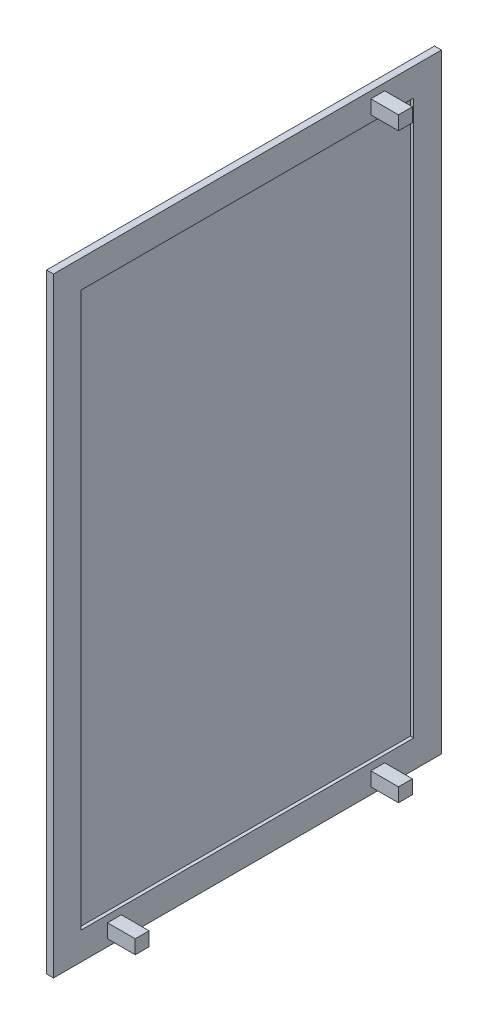
ISO-10303-21;
HEADER;
FILE_DESCRIPTION(('STEP AP214'),'2;1');
FILE_NAME('part.step','',(''),(''),'','','');
FILE_SCHEMA(('AUTOMOTIVE_DESIGN { 1 0 10303 214 1 1 1 1 }'));
ENDSEC;
DATA;
#1=APPLICATION_CONTEXT('core data for automotive mechanical design processes');
#2=APPLICATION_PROTOCOL_DEFINITION('international standard','automotive_design',2000,#1);
#3=PRODUCT_CONTEXT('',#1,'mechanical');
#4=PRODUCT('Part','Part','',(#3));
#5=PRODUCT_RELATED_PRODUCT_CATEGORY('part','',(#4));
#6=PRODUCT_DEFINITION_FORMATION('','',#4);
#7=PRODUCT_DEFINITION_CONTEXT('part definition',#1,'design');
#8=PRODUCT_DEFINITION('design','',#6,#7);
#9=PRODUCT_DEFINITION_SHAPE('','',#8);
#10=(LENGTH_UNIT() NAMED_UNIT(*) SI_UNIT(.MILLI.,.METRE.));
#11=(NAMED_UNIT(*) PLANE_ANGLE_UNIT() SI_UNIT($,.RADIAN.));
#12=(NAMED_UNIT(*) SI_UNIT($,.STERADIAN.) SOLID_ANGLE_UNIT());
#13=UNCERTAINTY_MEASURE_WITH_UNIT(LENGTH_MEASURE(1.E-05),#10,'distance_accuracy_value','');
#14=(GEOMETRIC_REPRESENTATION_CONTEXT(3) GLOBAL_UNCERTAINTY_ASSIGNED_CONTEXT((#13)) GLOBAL_UNIT_ASSIGNED_CONTEXT((#10,
#11,#12)) REPRESENTATION_CONTEXT('',''));
#15=CARTESIAN_POINT('',(0.,0.,0.));
#16=DIRECTION('',(0.,0.,1.));
#17=DIRECTION('',(1.,0.,0.));
#18=AXIS2_PLACEMENT_3D('',#15,#16,#17);
#19=CARTESIAN_POINT('',(1.25,0.,0.));
#20=DIRECTION('',(-1.,0.,0.));
#21=DIRECTION('',(0.,0.,1.));
#22=AXIS2_PLACEMENT_3D('',#19,#20,#21);
#23=PLANE('',#22);
#24=DIRECTION('',(0.,0.,-1.));
#25=VECTOR('',#24,1.);
#26=CARTESIAN_POINT('',(1.25,5.,-5.00000000000001));
#27=LINE('',#26,#25);
#28=CARTESIAN_POINT('',(1.25,5.,-5.00000000000001));
#29=VERTEX_POINT('',#28);
#30=CARTESIAN_POINT('',(1.25,5.,-65.));
#31=VERTEX_POINT('',#30);
#32=EDGE_CURVE('E199',#29,#31,#27,.T.);
#33=ORIENTED_EDGE('',*,*,#32,.F.);
#34=DIRECTION('',(0.,-1.,0.));
#35=VECTOR('',#34,1.);
#36=CARTESIAN_POINT('',(1.25,105.,-5.));
#37=LINE('',#36,#35);
#38=CARTESIAN_POINT('',(1.25,105.,-5.));
#39=VERTEX_POINT('',#38);
#40=EDGE_CURVE('E48',#39,#29,#37,.T.);
#41=ORIENTED_EDGE('',*,*,#40,.F.);
#42=DIRECTION('',(0.,0.,1.));
#43=VECTOR('',#42,1.);
#44=CARTESIAN_POINT('',(1.25,105.,-5.));
#45=LINE('',#44,#43);
#46=CARTESIAN_POINT('',(1.25,105.,-65.));
#47=VERTEX_POINT('',#46);
#48=EDGE_CURVE('E190',#47,#39,#45,.T.);
#49=ORIENTED_EDGE('',*,*,#48,.F.);
#50=DIRECTION('',(0.,1.,0.));
#51=VECTOR('',#50,1.);
#52=CARTESIAN_POINT('',(1.25,105.,-65.));
#53=LINE('',#52,#51);
#54=EDGE_CURVE('E193',#31,#47,#53,.T.);
#55=ORIENTED_EDGE('',*,*,#54,.F.);
#56=EDGE_LOOP('',(#33,#41,#49,#55));
#57=FACE_BOUND('',#56,.T.);
#58=DIRECTION('',(0.,-1.,0.));
#59=VECTOR('',#58,1.);
#60=CARTESIAN_POINT('',(1.25,3.75,-9.75000000000001));
#61=LINE('',#60,#59);
#62=CARTESIAN_POINT('',(1.25,3.75,-9.75000000000001));
#63=VERTEX_POINT('',#62);
#64=CARTESIAN_POINT('',(1.25,1.25,-9.75000000000001));
#65=VERTEX_POINT('',#64);
#66=EDGE_CURVE('E238',#63,#65,#61,.T.);
#67=ORIENTED_EDGE('',*,*,#66,.F.);
#68=DIRECTION('',(0.,0.,1.));
#69=VECTOR('',#68,1.);
#70=CARTESIAN_POINT('',(1.25,3.75,-9.75000000000001));
#71=LINE('',#70,#69);
#72=CARTESIAN_POINT('',(1.25,3.75,-12.25));
#73=VERTEX_POINT('',#72);
#74=EDGE_CURVE('E243',#73,#63,#71,.T.);
#75=ORIENTED_EDGE('',*,*,#74,.F.);
#76=DIRECTION('',(0.,1.,0.));
#77=VECTOR('',#76,1.);
#78=CARTESIAN_POINT('',(1.25,3.75,-12.25));
#79=LINE('',#78,#77);
#80=CARTESIAN_POINT('',(1.25,1.25,-12.25));
#81=VERTEX_POINT('',#80);
#82=EDGE_CURVE('E255',#81,#73,#79,.T.);
#83=ORIENTED_EDGE('',*,*,#82,.F.);
#84=DIRECTION('',(0.,0.,-1.));
#85=VECTOR('',#84,1.);
#86=CARTESIAN_POINT('',(1.25,1.25,-9.75000000000001));
#87=LINE('',#86,#85);
#88=EDGE_CURVE('E252',#65,#81,#87,.T.);
#89=ORIENTED_EDGE('',*,*,#88,.F.);
#90=EDGE_LOOP('',(#67,#75,#83,#89));
#91=FACE_BOUND('',#90,.T.);
#92=DIRECTION('',(0.,-1.,0.));
#93=VECTOR('',#92,1.);
#94=CARTESIAN_POINT('',(1.25,0.,0.));
#95=LINE('',#94,#93);
#96=CARTESIAN_POINT('',(1.25,110.,0.));
#97=VERTEX_POINT('',#96);
#98=CARTESIAN_POINT('',(1.25,0.,0.));
#99=VERTEX_POINT('',#98);
#100=EDGE_CURVE('E305',#97,#99,#95,.T.);
#101=ORIENTED_EDGE('',*,*,#100,.T.);
#102=DIRECTION('',(0.,0.,-1.));
#103=VECTOR('',#102,1.);
#104=CARTESIAN_POINT('',(1.25,0.,0.));
#105=LINE('',#104,#103);
#106=CARTESIAN_POINT('',(1.25,0.,-70.));
#107=VERTEX_POINT('',#106);
#108=EDGE_CURVE('E308',#99,#107,#105,.T.);
#109=ORIENTED_EDGE('',*,*,#108,.T.);
#110=DIRECTION('',(0.,1.,0.));
#111=VECTOR('',#110,1.);
#112=CARTESIAN_POINT('',(1.25,0.,-70.));
#113=LINE('',#112,#111);
#114=CARTESIAN_POINT('',(1.25,110.,-70.));
#115=VERTEX_POINT('',#114);
#116=EDGE_CURVE('E311',#107,#115,#113,.T.);
#117=ORIENTED_EDGE('',*,*,#116,.T.);
#118=DIRECTION('',(0.,0.,1.));
#119=VECTOR('',#118,1.);
#120=CARTESIAN_POINT('',(1.25,110.,0.));
#121=LINE('',#120,#119);
#122=EDGE_CURVE('E313',#115,#97,#121,.T.);
#123=ORIENTED_EDGE('',*,*,#122,.T.);
#124=EDGE_LOOP('',(#101,#109,#117,#123));
#125=FACE_BOUND('',#124,.T.);
#126=DIRECTION('',(0.,-1.,0.));
#127=VECTOR('',#126,1.);
#128=CARTESIAN_POINT('',(1.25,108.75,-57.25));
#129=LINE('',#128,#127);
#130=CARTESIAN_POINT('',(1.25,108.75,-57.25));
#131=VERTEX_POINT('',#130);
#132=CARTESIAN_POINT('',(1.25,106.25,-57.25));
#133=VERTEX_POINT('',#132);
#134=EDGE_CURVE('E271',#131,#133,#129,.T.);
#135=ORIENTED_EDGE('',*,*,#134,.F.);
#136=DIRECTION('',(0.,0.,1.));
#137=VECTOR('',#136,1.);
#138=CARTESIAN_POINT('',(1.25,108.75,-57.25));
#139=LINE('',#138,#137);
#140=CARTESIAN_POINT('',(1.25,108.75,-59.75));
#141=VERTEX_POINT('',#140);
#142=EDGE_CURVE('E276',#141,#131,#139,.T.);
#143=ORIENTED_EDGE('',*,*,#142,.F.);
#144=DIRECTION('',(0.,1.,0.));
#145=VECTOR('',#144,1.);
#146=CARTESIAN_POINT('',(1.25,108.75,-59.75));
#147=LINE('',#146,#145);
#148=CARTESIAN_POINT('',(1.25,106.25,-59.75));
#149=VERTEX_POINT('',#148);
#150=EDGE_CURVE('E288',#149,#141,#147,.T.);
#151=ORIENTED_EDGE('',*,*,#150,.F.);
#152=DIRECTION('',(0.,0.,-1.));
#153=VECTOR('',#152,1.);
#154=CARTESIAN_POINT('',(1.25,106.25,-57.25));
#155=LINE('',#154,#153);
#156=EDGE_CURVE('E285',#133,#149,#155,.T.);
#157=ORIENTED_EDGE('',*,*,#156,.F.);
#158=EDGE_LOOP('',(#135,#143,#151,#157));
#159=FACE_BOUND('',#158,.T.);
#160=DIRECTION('',(0.,-1.,0.));
#161=VECTOR('',#160,1.);
#162=CARTESIAN_POINT('',(1.25,3.75,-57.25));
#163=LINE('',#162,#161);
#164=CARTESIAN_POINT('',(1.25,3.75,-57.25));
#165=VERTEX_POINT('',#164);
#166=CARTESIAN_POINT('',(1.25,1.25,-57.25));
#167=VERTEX_POINT('',#166);
#168=EDGE_CURVE('E205',#165,#167,#163,.T.);
#169=ORIENTED_EDGE('',*,*,#168,.F.);
#170=DIRECTION('',(0.,0.,1.));
#171=VECTOR('',#170,1.);
#172=CARTESIAN_POINT('',(1.25,3.75,-57.25));
#173=LINE('',#172,#171);
#174=CARTESIAN_POINT('',(1.25,3.75,-59.75));
#175=VERTEX_POINT('',#174);
#176=EDGE_CURVE('E213',#175,#165,#173,.T.);
#177=ORIENTED_EDGE('',*,*,#176,.F.);
#178=DIRECTION('',(0.,1.,0.));
#179=VECTOR('',#178,1.);
#180=CARTESIAN_POINT('',(1.25,3.75,-59.75));
#181=LINE('',#180,#179);
#182=CARTESIAN_POINT('',(1.25,1.25,-59.75));
#183=VERTEX_POINT('',#182);
#184=EDGE_CURVE('E223',#183,#175,#181,.T.);
#185=ORIENTED_EDGE('',*,*,#184,.F.);
#186=DIRECTION('',(0.,0.,-1.));
#187=VECTOR('',#186,1.);
#188=CARTESIAN_POINT('',(1.25,1.25,-57.25));
#189=LINE('',#188,#187);
#190=EDGE_CURVE('E56',#167,#183,#189,.T.);
#191=ORIENTED_EDGE('',*,*,#190,.F.);
#192=EDGE_LOOP('',(#169,#177,#185,#191));
#193=FACE_BOUND('',#192,.T.);
#194=ADVANCED_FACE('F33',(#57,#91,#125,#159,#193),#23,.F.);
#195=CARTESIAN_POINT('',(1.25,0.,0.));
#196=DIRECTION('',(0.,0.,-1.));
#197=DIRECTION('',(-1.,0.,0.));
#198=AXIS2_PLACEMENT_3D('',#195,#196,#197);
#199=PLANE('',#198);
#200=DIRECTION('',(0.,-1.,0.));
#201=VECTOR('',#200,1.);
#202=CARTESIAN_POINT('',(0.,0.,0.));
#203=LINE('',#202,#201);
#204=CARTESIAN_POINT('',(0.,110.,0.));
#205=VERTEX_POINT('',#204);
#206=CARTESIAN_POINT('',(0.,0.,0.));
#207=VERTEX_POINT('',#206);
#208=EDGE_CURVE('E304',#205,#207,#203,.T.);
#209=ORIENTED_EDGE('',*,*,#208,.T.);
#210=DIRECTION('',(-1.,0.,0.));
#211=VECTOR('',#210,1.);
#212=CARTESIAN_POINT('',(1.25,0.,0.));
#213=LINE('',#212,#211);
#214=EDGE_CURVE('E11',#99,#207,#213,.T.);
#215=ORIENTED_EDGE('',*,*,#214,.F.);
#216=ORIENTED_EDGE('',*,*,#100,.F.);
#217=DIRECTION('',(-1.,0.,0.));
#218=VECTOR('',#217,1.);
#219=CARTESIAN_POINT('',(1.25,110.,0.));
#220=LINE('',#219,#218);
#221=EDGE_CURVE('E315',#97,#205,#220,.T.);
#222=ORIENTED_EDGE('',*,*,#221,.T.);
#223=EDGE_LOOP('',(#209,#215,#216,#222));
#224=FACE_BOUND('',#223,.T.);
#225=ADVANCED_FACE('F35',(#224),#199,.F.);
#226=CARTESIAN_POINT('',(1.25,0.,0.));
#227=DIRECTION('',(0.,1.,0.));
#228=DIRECTION('',(0.,0.,1.));
#229=AXIS2_PLACEMENT_3D('',#226,#227,#228);
#230=PLANE('',#229);
#231=DIRECTION('',(0.,0.,-1.));
#232=VECTOR('',#231,1.);
#233=CARTESIAN_POINT('',(0.,0.,0.));
#234=LINE('',#233,#232);
#235=CARTESIAN_POINT('',(0.,0.,-70.));
#236=VERTEX_POINT('',#235);
#237=EDGE_CURVE('E318',#207,#236,#234,.T.);
#238=ORIENTED_EDGE('',*,*,#237,.T.);
#239=DIRECTION('',(-1.,0.,0.));
#240=VECTOR('',#239,1.);
#241=CARTESIAN_POINT('',(1.25,0.,-70.));
#242=LINE('',#241,#240);
#243=EDGE_CURVE('E41',#107,#236,#242,.T.);
#244=ORIENTED_EDGE('',*,*,#243,.F.);
#245=ORIENTED_EDGE('',*,*,#108,.F.);
#246=ORIENTED_EDGE('',*,*,#214,.T.);
#247=EDGE_LOOP('',(#238,#244,#245,#246));
#248=FACE_BOUND('',#247,.T.);
#249=ADVANCED_FACE('F348',(#248),#230,.F.);
#250=CARTESIAN_POINT('',(1.25,0.,-70.));
#251=DIRECTION('',(0.,0.,1.));
#252=DIRECTION('',(1.,0.,0.));
#253=AXIS2_PLACEMENT_3D('',#250,#251,#252);
#254=PLANE('',#253);
#255=DIRECTION('',(0.,1.,0.));
#256=VECTOR('',#255,1.);
#257=CARTESIAN_POINT('',(0.,0.,-70.));
#258=LINE('',#257,#256);
#259=CARTESIAN_POINT('',(0.,110.,-70.));
#260=VERTEX_POINT('',#259);
#261=EDGE_CURVE('E320',#236,#260,#258,.T.);
#262=ORIENTED_EDGE('',*,*,#261,.T.);
#263=DIRECTION('',(-1.,0.,0.));
#264=VECTOR('',#263,1.);
#265=CARTESIAN_POINT('',(1.25,110.,-70.));
#266=LINE('',#265,#264);
#267=EDGE_CURVE('E325',#115,#260,#266,.T.);
#268=ORIENTED_EDGE('',*,*,#267,.F.);
#269=ORIENTED_EDGE('',*,*,#116,.F.);
#270=ORIENTED_EDGE('',*,*,#243,.T.);
#271=EDGE_LOOP('',(#262,#268,#269,#270));
#272=FACE_BOUND('',#271,.T.);
#273=ADVANCED_FACE('F332',(#272),#254,.F.);
#274=CARTESIAN_POINT('',(1.25,110.,0.));
#275=DIRECTION('',(0.,-1.,0.));
#276=DIRECTION('',(0.,0.,-1.));
#277=AXIS2_PLACEMENT_3D('',#274,#275,#276);
#278=PLANE('',#277);
#279=DIRECTION('',(0.,0.,1.));
#280=VECTOR('',#279,1.);
#281=CARTESIAN_POINT('',(0.,110.,0.));
#282=LINE('',#281,#280);
#283=EDGE_CURVE('E309',#260,#205,#282,.T.);
#284=ORIENTED_EDGE('',*,*,#283,.T.);
#285=ORIENTED_EDGE('',*,*,#221,.F.);
#286=ORIENTED_EDGE('',*,*,#122,.F.);
#287=ORIENTED_EDGE('',*,*,#267,.T.);
#288=EDGE_LOOP('',(#284,#285,#286,#287));
#289=FACE_BOUND('',#288,.T.);
#290=ADVANCED_FACE('F341',(#289),#278,.F.);
#291=CARTESIAN_POINT('',(0.,0.,0.));
#292=DIRECTION('',(-1.,0.,0.));
#293=DIRECTION('',(0.,0.,1.));
#294=AXIS2_PLACEMENT_3D('',#291,#292,#293);
#295=PLANE('',#294);
#296=ORIENTED_EDGE('',*,*,#208,.F.);
#297=ORIENTED_EDGE('',*,*,#283,.F.);
#298=ORIENTED_EDGE('',*,*,#261,.F.);
#299=ORIENTED_EDGE('',*,*,#237,.F.);
#300=EDGE_LOOP('',(#296,#297,#298,#299));
#301=FACE_BOUND('',#300,.T.);
#302=ADVANCED_FACE('F338',(#301),#295,.T.);
#303=CARTESIAN_POINT('',(6.25,108.75,-57.25));
#304=DIRECTION('',(0.,0.,-1.));
#305=DIRECTION('',(-1.,0.,0.));
#306=AXIS2_PLACEMENT_3D('',#303,#304,#305);
#307=PLANE('',#306);
#308=ORIENTED_EDGE('',*,*,#134,.T.);
#309=DIRECTION('',(-1.,0.,0.));
#310=VECTOR('',#309,1.);
#311=CARTESIAN_POINT('',(6.25,106.25,-57.25));
#312=LINE('',#311,#310);
#313=CARTESIAN_POINT('',(6.25,106.25,-57.25));
#314=VERTEX_POINT('',#313);
#315=EDGE_CURVE('E301',#314,#133,#312,.T.);
#316=ORIENTED_EDGE('',*,*,#315,.F.);
#317=DIRECTION('',(0.,-1.,0.));
#318=VECTOR('',#317,1.);
#319=CARTESIAN_POINT('',(6.25,108.75,-57.25));
#320=LINE('',#319,#318);
#321=CARTESIAN_POINT('',(6.25,108.75,-57.25));
#322=VERTEX_POINT('',#321);
#323=EDGE_CURVE('E272',#322,#314,#320,.T.);
#324=ORIENTED_EDGE('',*,*,#323,.F.);
#325=DIRECTION('',(-1.,0.,0.));
#326=VECTOR('',#325,1.);
#327=CARTESIAN_POINT('',(6.25,108.75,-57.25));
#328=LINE('',#327,#326);
#329=EDGE_CURVE('E282',#322,#131,#328,.T.);
#330=ORIENTED_EDGE('',*,*,#329,.T.);
#331=EDGE_LOOP('',(#308,#316,#324,#330));
#332=FACE_BOUND('',#331,.T.);
#333=ADVANCED_FACE('F365',(#332),#307,.F.);
#334=CARTESIAN_POINT('',(6.25,106.25,-57.25));
#335=DIRECTION('',(0.,1.,0.));
#336=DIRECTION('',(0.,0.,1.));
#337=AXIS2_PLACEMENT_3D('',#334,#335,#336);
#338=PLANE('',#337);
#339=ORIENTED_EDGE('',*,*,#156,.T.);
#340=DIRECTION('',(-1.,0.,0.));
#341=VECTOR('',#340,1.);
#342=CARTESIAN_POINT('',(6.25,106.25,-59.75));
#343=LINE('',#342,#341);
#344=CARTESIAN_POINT('',(6.25,106.25,-59.75));
#345=VERTEX_POINT('',#344);
#346=EDGE_CURVE('E298',#345,#149,#343,.T.);
#347=ORIENTED_EDGE('',*,*,#346,.F.);
#348=DIRECTION('',(0.,0.,-1.));
#349=VECTOR('',#348,1.);
#350=CARTESIAN_POINT('',(6.25,106.25,-57.25));
#351=LINE('',#350,#349);
#352=EDGE_CURVE('E275',#314,#345,#351,.T.);
#353=ORIENTED_EDGE('',*,*,#352,.F.);
#354=ORIENTED_EDGE('',*,*,#315,.T.);
#355=EDGE_LOOP('',(#339,#347,#353,#354));
#356=FACE_BOUND('',#355,.T.);
#357=ADVANCED_FACE('F389',(#356),#338,.F.);
#358=CARTESIAN_POINT('',(6.25,108.75,-59.75));
#359=DIRECTION('',(0.,0.,1.));
#360=DIRECTION('',(1.,0.,0.));
#361=AXIS2_PLACEMENT_3D('',#358,#359,#360);
#362=PLANE('',#361);
#363=ORIENTED_EDGE('',*,*,#150,.T.);
#364=DIRECTION('',(-1.,0.,0.));
#365=VECTOR('',#364,1.);
#366=CARTESIAN_POINT('',(6.25,108.75,-59.75));
#367=LINE('',#366,#365);
#368=CARTESIAN_POINT('',(6.25,108.75,-59.75));
#369=VERTEX_POINT('',#368);
#370=EDGE_CURVE('E295',#369,#141,#367,.T.);
#371=ORIENTED_EDGE('',*,*,#370,.F.);
#372=DIRECTION('',(0.,1.,0.));
#373=VECTOR('',#372,1.);
#374=CARTESIAN_POINT('',(6.25,108.75,-59.75));
#375=LINE('',#374,#373);
#376=EDGE_CURVE('E278',#345,#369,#375,.T.);
#377=ORIENTED_EDGE('',*,*,#376,.F.);
#378=ORIENTED_EDGE('',*,*,#346,.T.);
#379=EDGE_LOOP('',(#363,#371,#377,#378));
#380=FACE_BOUND('',#379,.T.);
#381=ADVANCED_FACE('F395',(#380),#362,.F.);
#382=CARTESIAN_POINT('',(6.25,108.75,-57.25));
#383=DIRECTION('',(0.,-1.,0.));
#384=DIRECTION('',(0.,0.,-1.));
#385=AXIS2_PLACEMENT_3D('',#382,#383,#384);
#386=PLANE('',#385);
#387=ORIENTED_EDGE('',*,*,#142,.T.);
#388=ORIENTED_EDGE('',*,*,#329,.F.);
#389=DIRECTION('',(0.,0.,1.));
#390=VECTOR('',#389,1.);
#391=CARTESIAN_POINT('',(6.25,108.75,-57.25));
#392=LINE('',#391,#390);
#393=EDGE_CURVE('E280',#369,#322,#392,.T.);
#394=ORIENTED_EDGE('',*,*,#393,.F.);
#395=ORIENTED_EDGE('',*,*,#370,.T.);
#396=EDGE_LOOP('',(#387,#388,#394,#395));
#397=FACE_BOUND('',#396,.T.);
#398=ADVANCED_FACE('F402',(#397),#386,.F.);
#399=CARTESIAN_POINT('',(6.25,0.,0.));
#400=DIRECTION('',(1.,0.,0.));
#401=DIRECTION('',(0.,0.,-1.));
#402=AXIS2_PLACEMENT_3D('',#399,#400,#401);
#403=PLANE('',#402);
#404=ORIENTED_EDGE('',*,*,#323,.T.);
#405=ORIENTED_EDGE('',*,*,#352,.T.);
#406=ORIENTED_EDGE('',*,*,#376,.T.);
#407=ORIENTED_EDGE('',*,*,#393,.T.);
#408=EDGE_LOOP('',(#404,#405,#406,#407));
#409=FACE_BOUND('',#408,.T.);
#410=ADVANCED_FACE('F410',(#409),#403,.T.);
#411=CARTESIAN_POINT('',(6.25,3.75,-9.75000000000001));
#412=DIRECTION('',(0.,0.,-1.));
#413=DIRECTION('',(-1.,0.,0.));
#414=AXIS2_PLACEMENT_3D('',#411,#412,#413);
#415=PLANE('',#414);
#416=ORIENTED_EDGE('',*,*,#66,.T.);
#417=DIRECTION('',(-1.,0.,0.));
#418=VECTOR('',#417,1.);
#419=CARTESIAN_POINT('',(6.25,1.25,-9.75000000000001));
#420=LINE('',#419,#418);
#421=CARTESIAN_POINT('',(6.25,1.25,-9.75000000000001));
#422=VERTEX_POINT('',#421);
#423=EDGE_CURVE('E268',#422,#65,#420,.T.);
#424=ORIENTED_EDGE('',*,*,#423,.F.);
#425=DIRECTION('',(0.,-1.,0.));
#426=VECTOR('',#425,1.);
#427=CARTESIAN_POINT('',(6.25,3.75,-9.75000000000001));
#428=LINE('',#427,#426);
#429=CARTESIAN_POINT('',(6.25,3.75,-9.75000000000001));
#430=VERTEX_POINT('',#429);
#431=EDGE_CURVE('E239',#430,#422,#428,.T.);
#432=ORIENTED_EDGE('',*,*,#431,.F.);
#433=DIRECTION('',(-1.,0.,0.));
#434=VECTOR('',#433,1.);
#435=CARTESIAN_POINT('',(6.25,3.75,-9.75000000000001));
#436=LINE('',#435,#434);
#437=EDGE_CURVE('E249',#430,#63,#436,.T.);
#438=ORIENTED_EDGE('',*,*,#437,.T.);
#439=EDGE_LOOP('',(#416,#424,#432,#438));
#440=FACE_BOUND('',#439,.T.);
#441=ADVANCED_FACE('F418',(#440),#415,.F.);
#442=CARTESIAN_POINT('',(6.25,1.25,-9.75000000000001));
#443=DIRECTION('',(0.,1.,0.));
#444=DIRECTION('',(0.,0.,1.));
#445=AXIS2_PLACEMENT_3D('',#442,#443,#444);
#446=PLANE('',#445);
#447=ORIENTED_EDGE('',*,*,#88,.T.);
#448=DIRECTION('',(-1.,0.,0.));
#449=VECTOR('',#448,1.);
#450=CARTESIAN_POINT('',(6.25,1.25,-12.25));
#451=LINE('',#450,#449);
#452=CARTESIAN_POINT('',(6.25,1.25,-12.25));
#453=VERTEX_POINT('',#452);
#454=EDGE_CURVE('E265',#453,#81,#451,.T.);
#455=ORIENTED_EDGE('',*,*,#454,.F.);
#456=DIRECTION('',(0.,0.,-1.));
#457=VECTOR('',#456,1.);
#458=CARTESIAN_POINT('',(6.25,1.25,-9.75000000000001));
#459=LINE('',#458,#457);
#460=EDGE_CURVE('E242',#422,#453,#459,.T.);
#461=ORIENTED_EDGE('',*,*,#460,.F.);
#462=ORIENTED_EDGE('',*,*,#423,.T.);
#463=EDGE_LOOP('',(#447,#455,#461,#462));
#464=FACE_BOUND('',#463,.T.);
#465=ADVANCED_FACE('F426',(#464),#446,.F.);
#466=CARTESIAN_POINT('',(6.25,3.75,-12.25));
#467=DIRECTION('',(0.,0.,1.));
#468=DIRECTION('',(0.,-1.,0.));
#469=AXIS2_PLACEMENT_3D('',#466,#467,#468);
#470=PLANE('',#469);
#471=ORIENTED_EDGE('',*,*,#82,.T.);
#472=DIRECTION('',(-1.,0.,0.));
#473=VECTOR('',#472,1.);
#474=CARTESIAN_POINT('',(6.25,3.75,-12.25));
#475=LINE('',#474,#473);
#476=CARTESIAN_POINT('',(6.25,3.75,-12.25));
#477=VERTEX_POINT('',#476);
#478=EDGE_CURVE('E262',#477,#73,#475,.T.);
#479=ORIENTED_EDGE('',*,*,#478,.F.);
#480=DIRECTION('',(0.,1.,0.));
#481=VECTOR('',#480,1.);
#482=CARTESIAN_POINT('',(6.25,3.75,-12.25));
#483=LINE('',#482,#481);
#484=EDGE_CURVE('E245',#453,#477,#483,.T.);
#485=ORIENTED_EDGE('',*,*,#484,.F.);
#486=ORIENTED_EDGE('',*,*,#454,.T.);
#487=EDGE_LOOP('',(#471,#479,#485,#486));
#488=FACE_BOUND('',#487,.T.);
#489=ADVANCED_FACE('F434',(#488),#470,.F.);
#490=CARTESIAN_POINT('',(6.25,3.75,-9.75000000000001));
#491=DIRECTION('',(0.,-1.,0.));
#492=DIRECTION('',(0.,0.,-1.));
#493=AXIS2_PLACEMENT_3D('',#490,#491,#492);
#494=PLANE('',#493);
#495=ORIENTED_EDGE('',*,*,#74,.T.);
#496=ORIENTED_EDGE('',*,*,#437,.F.);
#497=DIRECTION('',(0.,0.,1.));
#498=VECTOR('',#497,1.);
#499=CARTESIAN_POINT('',(6.25,3.75,-9.75000000000001));
#500=LINE('',#499,#498);
#501=EDGE_CURVE('E247',#477,#430,#500,.T.);
#502=ORIENTED_EDGE('',*,*,#501,.F.);
#503=ORIENTED_EDGE('',*,*,#478,.T.);
#504=EDGE_LOOP('',(#495,#496,#502,#503));
#505=FACE_BOUND('',#504,.T.);
#506=ADVANCED_FACE('F442',(#505),#494,.F.);
#507=CARTESIAN_POINT('',(6.25,0.,0.));
#508=DIRECTION('',(1.,0.,0.));
#509=DIRECTION('',(0.,0.,-1.));
#510=AXIS2_PLACEMENT_3D('',#507,#508,#509);
#511=PLANE('',#510);
#512=ORIENTED_EDGE('',*,*,#431,.T.);
#513=ORIENTED_EDGE('',*,*,#460,.T.);
#514=ORIENTED_EDGE('',*,*,#484,.T.);
#515=ORIENTED_EDGE('',*,*,#501,.T.);
#516=EDGE_LOOP('',(#512,#513,#514,#515));
#517=FACE_BOUND('',#516,.T.);
#518=ADVANCED_FACE('F450',(#517),#511,.T.);
#519=CARTESIAN_POINT('',(6.25,3.75,-57.25));
#520=DIRECTION('',(0.,0.,-1.));
#521=DIRECTION('',(-1.,0.,0.));
#522=AXIS2_PLACEMENT_3D('',#519,#520,#521);
#523=PLANE('',#522);
#524=ORIENTED_EDGE('',*,*,#168,.T.);
#525=DIRECTION('',(-1.,0.,0.));
#526=VECTOR('',#525,1.);
#527=CARTESIAN_POINT('',(6.25,1.25,-57.25));
#528=LINE('',#527,#526);
#529=CARTESIAN_POINT('',(6.25,1.25,-57.25));
#530=VERTEX_POINT('',#529);
#531=EDGE_CURVE('E236',#530,#167,#528,.T.);
#532=ORIENTED_EDGE('',*,*,#531,.F.);
#533=DIRECTION('',(0.,-1.,0.));
#534=VECTOR('',#533,1.);
#535=CARTESIAN_POINT('',(6.25,3.75,-57.25));
#536=LINE('',#535,#534);
#537=CARTESIAN_POINT('',(6.25,3.75,-57.25));
#538=VERTEX_POINT('',#537);
#539=EDGE_CURVE('E209',#538,#530,#536,.T.);
#540=ORIENTED_EDGE('',*,*,#539,.F.);
#541=DIRECTION('',(-1.,0.,0.));
#542=VECTOR('',#541,1.);
#543=CARTESIAN_POINT('',(6.25,3.75,-57.25));
#544=LINE('',#543,#542);
#545=EDGE_CURVE('E219',#538,#165,#544,.T.);
#546=ORIENTED_EDGE('',*,*,#545,.T.);
#547=EDGE_LOOP('',(#524,#532,#540,#546));
#548=FACE_BOUND('',#547,.T.);
#549=ADVANCED_FACE('F458',(#548),#523,.F.);
#550=CARTESIAN_POINT('',(6.25,1.25,-57.25));
#551=DIRECTION('',(0.,1.,0.));
#552=DIRECTION('',(0.,0.,1.));
#553=AXIS2_PLACEMENT_3D('',#550,#551,#552);
#554=PLANE('',#553);
#555=ORIENTED_EDGE('',*,*,#190,.T.);
#556=DIRECTION('',(-1.,0.,0.));
#557=VECTOR('',#556,1.);
#558=CARTESIAN_POINT('',(6.25,1.25,-59.75));
#559=LINE('',#558,#557);
#560=CARTESIAN_POINT('',(6.25,1.25,-59.75));
#561=VERTEX_POINT('',#560);
#562=EDGE_CURVE('E233',#561,#183,#559,.T.);
#563=ORIENTED_EDGE('',*,*,#562,.F.);
#564=DIRECTION('',(0.,0.,-1.));
#565=VECTOR('',#564,1.);
#566=CARTESIAN_POINT('',(6.25,1.25,-57.25));
#567=LINE('',#566,#565);
#568=EDGE_CURVE('E212',#530,#561,#567,.T.);
#569=ORIENTED_EDGE('',*,*,#568,.F.);
#570=ORIENTED_EDGE('',*,*,#531,.T.);
#571=EDGE_LOOP('',(#555,#563,#569,#570));
#572=FACE_BOUND('',#571,.T.);
#573=ADVANCED_FACE('F466',(#572),#554,.F.);
#574=CARTESIAN_POINT('',(6.25,3.75,-59.75));
#575=DIRECTION('',(0.,0.,1.));
#576=DIRECTION('',(1.,0.,0.));
#577=AXIS2_PLACEMENT_3D('',#574,#575,#576);
#578=PLANE('',#577);
#579=ORIENTED_EDGE('',*,*,#184,.T.);
#580=DIRECTION('',(-1.,0.,0.));
#581=VECTOR('',#580,1.);
#582=CARTESIAN_POINT('',(6.25,3.75,-59.75));
#583=LINE('',#582,#581);
#584=CARTESIAN_POINT('',(6.25,3.75,-59.75));
#585=VERTEX_POINT('',#584);
#586=EDGE_CURVE('E230',#585,#175,#583,.T.);
#587=ORIENTED_EDGE('',*,*,#586,.F.);
#588=DIRECTION('',(0.,1.,0.));
#589=VECTOR('',#588,1.);
#590=CARTESIAN_POINT('',(6.25,3.75,-59.75));
#591=LINE('',#590,#589);
#592=EDGE_CURVE('E215',#561,#585,#591,.T.);
#593=ORIENTED_EDGE('',*,*,#592,.F.);
#594=ORIENTED_EDGE('',*,*,#562,.T.);
#595=EDGE_LOOP('',(#579,#587,#593,#594));
#596=FACE_BOUND('',#595,.T.);
#597=ADVANCED_FACE('F474',(#596),#578,.F.);
#598=CARTESIAN_POINT('',(6.25,3.75,-57.25));
#599=DIRECTION('',(0.,-1.,0.));
#600=DIRECTION('',(0.,0.,-1.));
#601=AXIS2_PLACEMENT_3D('',#598,#599,#600);
#602=PLANE('',#601);
#603=ORIENTED_EDGE('',*,*,#176,.T.);
#604=ORIENTED_EDGE('',*,*,#545,.F.);
#605=DIRECTION('',(0.,0.,1.));
#606=VECTOR('',#605,1.);
#607=CARTESIAN_POINT('',(6.25,3.75,-57.25));
#608=LINE('',#607,#606);
#609=EDGE_CURVE('E217',#585,#538,#608,.T.);
#610=ORIENTED_EDGE('',*,*,#609,.F.);
#611=ORIENTED_EDGE('',*,*,#586,.T.);
#612=EDGE_LOOP('',(#603,#604,#610,#611));
#613=FACE_BOUND('',#612,.T.);
#614=ADVANCED_FACE('F482',(#613),#602,.F.);
#615=CARTESIAN_POINT('',(6.25,0.,0.));
#616=DIRECTION('',(1.,0.,0.));
#617=DIRECTION('',(0.,0.,-1.));
#618=AXIS2_PLACEMENT_3D('',#615,#616,#617);
#619=PLANE('',#618);
#620=ORIENTED_EDGE('',*,*,#539,.T.);
#621=ORIENTED_EDGE('',*,*,#568,.T.);
#622=ORIENTED_EDGE('',*,*,#592,.T.);
#623=ORIENTED_EDGE('',*,*,#609,.T.);
#624=EDGE_LOOP('',(#620,#621,#622,#623));
#625=FACE_BOUND('',#624,.T.);
#626=ADVANCED_FACE('F490',(#625),#619,.T.);
#627=CARTESIAN_POINT('',(0.65,105.,-5.));
#628=DIRECTION('',(0.,0.,1.));
#629=DIRECTION('',(0.,-1.,0.));
#630=AXIS2_PLACEMENT_3D('',#627,#628,#629);
#631=PLANE('',#630);
#632=ORIENTED_EDGE('',*,*,#40,.T.);
#633=DIRECTION('',(1.,0.,0.));
#634=VECTOR('',#633,1.);
#635=CARTESIAN_POINT('',(0.65,5.,-5.00000000000001));
#636=LINE('',#635,#634);
#637=CARTESIAN_POINT('',(0.65,5.,-5.00000000000001));
#638=VERTEX_POINT('',#637);
#639=EDGE_CURVE('E168',#638,#29,#636,.T.);
#640=ORIENTED_EDGE('',*,*,#639,.F.);
#641=DIRECTION('',(0.,-1.,0.));
#642=VECTOR('',#641,1.);
#643=CARTESIAN_POINT('',(0.65,105.,-5.));
#644=LINE('',#643,#642);
#645=CARTESIAN_POINT('',(0.65,105.,-5.));
#646=VERTEX_POINT('',#645);
#647=EDGE_CURVE('E172',#646,#638,#644,.T.);
#648=ORIENTED_EDGE('',*,*,#647,.F.);
#649=DIRECTION('',(1.,0.,0.));
#650=VECTOR('',#649,1.);
#651=CARTESIAN_POINT('',(0.65,105.,-5.));
#652=LINE('',#651,#650);
#653=EDGE_CURVE('E203',#646,#39,#652,.T.);
#654=ORIENTED_EDGE('',*,*,#653,.T.);
#655=EDGE_LOOP('',(#632,#640,#648,#654));
#656=FACE_BOUND('',#655,.T.);
#657=ADVANCED_FACE('F170',(#656),#631,.F.);
#658=CARTESIAN_POINT('',(0.65,105.,-5.));
#659=DIRECTION('',(0.,1.,0.));
#660=DIRECTION('',(0.,0.,1.));
#661=AXIS2_PLACEMENT_3D('',#658,#659,#660);
#662=PLANE('',#661);
#663=ORIENTED_EDGE('',*,*,#48,.T.);
#664=ORIENTED_EDGE('',*,*,#653,.F.);
#665=DIRECTION('',(0.,0.,1.));
#666=VECTOR('',#665,1.);
#667=CARTESIAN_POINT('',(0.65,105.,-5.));
#668=LINE('',#667,#666);
#669=CARTESIAN_POINT('',(0.65,105.,-65.));
#670=VERTEX_POINT('',#669);
#671=EDGE_CURVE('E178',#670,#646,#668,.T.);
#672=ORIENTED_EDGE('',*,*,#671,.F.);
#673=DIRECTION('',(1.,0.,0.));
#674=VECTOR('',#673,1.);
#675=CARTESIAN_POINT('',(0.65,105.,-65.));
#676=LINE('',#675,#674);
#677=EDGE_CURVE('E206',#670,#47,#676,.T.);
#678=ORIENTED_EDGE('',*,*,#677,.T.);
#679=EDGE_LOOP('',(#663,#664,#672,#678));
#680=FACE_BOUND('',#679,.T.);
#681=ADVANCED_FACE('F503',(#680),#662,.F.);
#682=CARTESIAN_POINT('',(0.65,105.,-65.));
#683=DIRECTION('',(0.,0.,-1.));
#684=DIRECTION('',(0.,1.,0.));
#685=AXIS2_PLACEMENT_3D('',#682,#683,#684);
#686=PLANE('',#685);
#687=ORIENTED_EDGE('',*,*,#54,.T.);
#688=ORIENTED_EDGE('',*,*,#677,.F.);
#689=DIRECTION('',(0.,1.,0.));
#690=VECTOR('',#689,1.);
#691=CARTESIAN_POINT('',(0.65,105.,-65.));
#692=LINE('',#691,#690);
#693=CARTESIAN_POINT('',(0.65,5.,-65.));
#694=VERTEX_POINT('',#693);
#695=EDGE_CURVE('E186',#694,#670,#692,.T.);
#696=ORIENTED_EDGE('',*,*,#695,.F.);
#697=DIRECTION('',(1.,0.,0.));
#698=VECTOR('',#697,1.);
#699=CARTESIAN_POINT('',(0.65,5.,-65.));
#700=LINE('',#699,#698);
#701=EDGE_CURVE('E177',#694,#31,#700,.T.);
#702=ORIENTED_EDGE('',*,*,#701,.T.);
#703=EDGE_LOOP('',(#687,#688,#696,#702));
#704=FACE_BOUND('',#703,.T.);
#705=ADVANCED_FACE('F510',(#704),#686,.F.);
#706=CARTESIAN_POINT('',(0.65,5.,-5.00000000000001));
#707=DIRECTION('',(0.,-1.,0.));
#708=DIRECTION('',(0.,0.,-1.));
#709=AXIS2_PLACEMENT_3D('',#706,#707,#708);
#710=PLANE('',#709);
#711=ORIENTED_EDGE('',*,*,#32,.T.);
#712=ORIENTED_EDGE('',*,*,#701,.F.);
#713=DIRECTION('',(0.,0.,-1.));
#714=VECTOR('',#713,1.);
#715=CARTESIAN_POINT('',(0.65,5.,-5.00000000000001));
#716=LINE('',#715,#714);
#717=EDGE_CURVE('E181',#638,#694,#716,.T.);
#718=ORIENTED_EDGE('',*,*,#717,.F.);
#719=ORIENTED_EDGE('',*,*,#639,.T.);
#720=EDGE_LOOP('',(#711,#712,#718,#719));
#721=FACE_BOUND('',#720,.T.);
#722=ADVANCED_FACE('F182',(#721),#710,.F.);
#723=CARTESIAN_POINT('',(0.65,0.,0.));
#724=DIRECTION('',(1.,0.,0.));
#725=DIRECTION('',(0.,0.,-1.));
#726=AXIS2_PLACEMENT_3D('',#723,#724,#725);
#727=PLANE('',#726);
#728=ORIENTED_EDGE('',*,*,#647,.T.);
#729=ORIENTED_EDGE('',*,*,#717,.T.);
#730=ORIENTED_EDGE('',*,*,#695,.T.);
#731=ORIENTED_EDGE('',*,*,#671,.T.);
#732=EDGE_LOOP('',(#728,#729,#730,#731));
#733=FACE_BOUND('',#732,.T.);
#734=ADVANCED_FACE('F188',(#733),#727,.T.);
#735=CLOSED_SHELL('',(#194,#225,#249,#273,#290,#302,#333,#357,#381,#398,#410,#441,#465,#489,
#506,#518,#549,#573,#597,#614,#626,#657,#681,#705,#722,#734));
#736=MANIFOLD_SOLID_BREP('B2',#735);
#737=ADVANCED_BREP_SHAPE_REPRESENTATION('',(#18,#736),#14);
#738=SHAPE_DEFINITION_REPRESENTATION(#9,#737);
ENDSEC;
END-ISO-10303-21;
